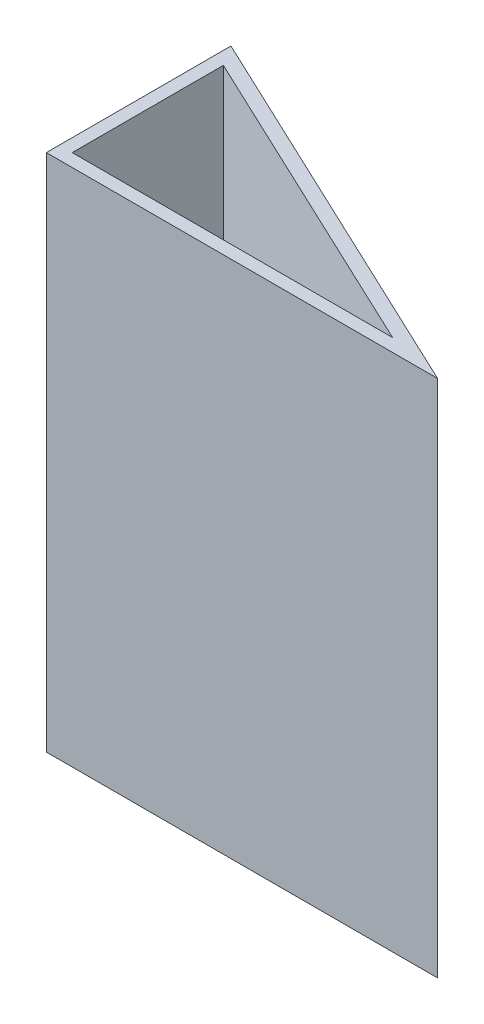
ISO-10303-21;
HEADER;
FILE_DESCRIPTION(('STEP AP214'),'2;1');
FILE_NAME('part.step','',(''),(''),'','','');
FILE_SCHEMA(('AUTOMOTIVE_DESIGN { 1 0 10303 214 1 1 1 1 }'));
ENDSEC;
DATA;
#1=APPLICATION_CONTEXT('core data for automotive mechanical design processes');
#2=APPLICATION_PROTOCOL_DEFINITION('international standard','automotive_design',2000,#1);
#3=PRODUCT_CONTEXT('',#1,'mechanical');
#4=PRODUCT('Part','Part','',(#3));
#5=PRODUCT_RELATED_PRODUCT_CATEGORY('part','',(#4));
#6=PRODUCT_DEFINITION_FORMATION('','',#4);
#7=PRODUCT_DEFINITION_CONTEXT('part definition',#1,'design');
#8=PRODUCT_DEFINITION('design','',#6,#7);
#9=PRODUCT_DEFINITION_SHAPE('','',#8);
#10=(LENGTH_UNIT() NAMED_UNIT(*) SI_UNIT(.MILLI.,.METRE.));
#11=(NAMED_UNIT(*) PLANE_ANGLE_UNIT() SI_UNIT($,.RADIAN.));
#12=(NAMED_UNIT(*) SI_UNIT($,.STERADIAN.) SOLID_ANGLE_UNIT());
#13=UNCERTAINTY_MEASURE_WITH_UNIT(LENGTH_MEASURE(1.E-05),#10,'distance_accuracy_value','');
#14=(GEOMETRIC_REPRESENTATION_CONTEXT(3) GLOBAL_UNCERTAINTY_ASSIGNED_CONTEXT((#13)) GLOBAL_UNIT_ASSIGNED_CONTEXT((#10,
#11,#12)) REPRESENTATION_CONTEXT('',''));
#15=CARTESIAN_POINT('',(0.,0.,0.));
#16=DIRECTION('',(0.,0.,1.));
#17=DIRECTION('',(1.,0.,0.));
#18=AXIS2_PLACEMENT_3D('',#15,#16,#17);
#19=CARTESIAN_POINT('',(-17.4601760956753,114.3,-2.47465147608017));
#20=DIRECTION('',(-0.426670121760486,0.,0.904407323719181));
#21=DIRECTION('',(0.904407323719181,0.,0.426670121760486));
#22=AXIS2_PLACEMENT_3D('',#19,#20,#21);
#23=PLANE('',#22);
#24=DIRECTION('',(-0.904407323719181,0.,-0.426670121760486));
#25=VECTOR('',#24,1.);
#26=CARTESIAN_POINT('',(-17.4601760956753,0.,-2.47465147608017));
#27=LINE('',#26,#25);
#28=CARTESIAN_POINT('',(68.6846214885767,0.,38.1656776216062));
#29=VERTEX_POINT('',#28);
#30=CARTESIAN_POINT('',(-17.4601760956753,0.,-2.47465147608017));
#31=VERTEX_POINT('',#30);
#32=EDGE_CURVE('E126',#29,#31,#27,.T.);
#33=ORIENTED_EDGE('',*,*,#32,.T.);
#34=DIRECTION('',(0.,-1.,0.));
#35=VECTOR('',#34,1.);
#36=CARTESIAN_POINT('',(-17.4601760956753,114.3,-2.47465147608017));
#37=LINE('',#36,#35);
#38=CARTESIAN_POINT('',(-17.4601760956753,114.3,-2.47465147608017));
#39=VERTEX_POINT('',#38);
#40=EDGE_CURVE('E11',#39,#31,#37,.T.);
#41=ORIENTED_EDGE('',*,*,#40,.F.);
#42=DIRECTION('',(-0.904407323719181,0.,-0.426670121760486));
#43=VECTOR('',#42,1.);
#44=CARTESIAN_POINT('',(-17.4601760956753,114.3,-2.47465147608017));
#45=LINE('',#44,#43);
#46=CARTESIAN_POINT('',(68.6846214885767,114.3,38.1656776216062));
#47=VERTEX_POINT('',#46);
#48=EDGE_CURVE('E129',#47,#39,#45,.T.);
#49=ORIENTED_EDGE('',*,*,#48,.F.);
#50=DIRECTION('',(0.,-1.,0.));
#51=VECTOR('',#50,1.);
#52=CARTESIAN_POINT('',(68.6846214885767,114.3,38.1656776216062));
#53=LINE('',#52,#51);
#54=EDGE_CURVE('E140',#47,#29,#53,.T.);
#55=ORIENTED_EDGE('',*,*,#54,.T.);
#56=EDGE_LOOP('',(#33,#41,#49,#55));
#57=FACE_BOUND('',#56,.T.);
#58=ADVANCED_FACE('F39',(#57),#23,.F.);
#59=CARTESIAN_POINT('',(-17.4601760956753,114.3,-2.47465147608017));
#60=DIRECTION('',(1.,0.,0.));
#61=DIRECTION('',(0.,0.,-1.));
#62=AXIS2_PLACEMENT_3D('',#59,#60,#61);
#63=PLANE('',#62);
#64=DIRECTION('',(0.,0.,1.));
#65=VECTOR('',#64,1.);
#66=CARTESIAN_POINT('',(-17.4601760956753,0.,-2.47465147608017));
#67=LINE('',#66,#65);
#68=CARTESIAN_POINT('',(-17.4601760956753,0.,38.1656776216062));
#69=VERTEX_POINT('',#68);
#70=EDGE_CURVE('E144',#31,#69,#67,.T.);
#71=ORIENTED_EDGE('',*,*,#70,.T.);
#72=DIRECTION('',(0.,-1.,0.));
#73=VECTOR('',#72,1.);
#74=CARTESIAN_POINT('',(-17.4601760956753,114.3,38.1656776216062));
#75=LINE('',#74,#73);
#76=CARTESIAN_POINT('',(-17.4601760956753,114.3,38.1656776216062));
#77=VERTEX_POINT('',#76);
#78=EDGE_CURVE('E47',#77,#69,#75,.T.);
#79=ORIENTED_EDGE('',*,*,#78,.F.);
#80=DIRECTION('',(0.,0.,1.));
#81=VECTOR('',#80,1.);
#82=CARTESIAN_POINT('',(-17.4601760956753,114.3,-2.47465147608017));
#83=LINE('',#82,#81);
#84=EDGE_CURVE('E133',#39,#77,#83,.T.);
#85=ORIENTED_EDGE('',*,*,#84,.F.);
#86=ORIENTED_EDGE('',*,*,#40,.T.);
#87=EDGE_LOOP('',(#71,#79,#85,#86));
#88=FACE_BOUND('',#87,.T.);
#89=ADVANCED_FACE('F166',(#88),#63,.F.);
#90=CARTESIAN_POINT('',(-17.4601760956753,114.3,38.1656776216062));
#91=DIRECTION('',(0.,0.,-1.));
#92=DIRECTION('',(-1.,0.,0.));
#93=AXIS2_PLACEMENT_3D('',#90,#91,#92);
#94=PLANE('',#93);
#95=DIRECTION('',(1.,0.,0.));
#96=VECTOR('',#95,1.);
#97=CARTESIAN_POINT('',(-17.4601760956753,0.,38.1656776216062));
#98=LINE('',#97,#96);
#99=EDGE_CURVE('E134',#69,#29,#98,.T.);
#100=ORIENTED_EDGE('',*,*,#99,.T.);
#101=ORIENTED_EDGE('',*,*,#54,.F.);
#102=DIRECTION('',(1.,0.,0.));
#103=VECTOR('',#102,1.);
#104=CARTESIAN_POINT('',(-17.4601760956753,114.3,38.1656776216062));
#105=LINE('',#104,#103);
#106=EDGE_CURVE('E137',#77,#47,#105,.T.);
#107=ORIENTED_EDGE('',*,*,#106,.F.);
#108=ORIENTED_EDGE('',*,*,#78,.T.);
#109=EDGE_LOOP('',(#100,#101,#107,#108));
#110=FACE_BOUND('',#109,.T.);
#111=ADVANCED_FACE('F157',(#110),#94,.F.);
#112=CARTESIAN_POINT('',(0.,114.3,0.));
#113=DIRECTION('',(0.,-1.,0.));
#114=DIRECTION('',(0.,0.,-1.));
#115=AXIS2_PLACEMENT_3D('',#112,#113,#114);
#116=PLANE('',#115);
#117=DIRECTION('',(0.,0.,1.));
#118=VECTOR('',#117,1.);
#119=CARTESIAN_POINT('',(-14.6065114956753,114.3,2.04687762160616));
#120=LINE('',#119,#118);
#121=CARTESIAN_POINT('',(-14.6065114956753,114.3,2.04687762160616));
#122=VERTEX_POINT('',#121);
#123=CARTESIAN_POINT('',(-14.6065114956753,114.3,35.3208776216062));
#124=VERTEX_POINT('',#123);
#125=EDGE_CURVE('E114',#122,#124,#120,.T.);
#126=ORIENTED_EDGE('',*,*,#125,.F.);
#127=DIRECTION('',(-0.904410470321237,0.,-0.426663451883706));
#128=VECTOR('',#127,1.);
#129=CARTESIAN_POINT('',(-14.6065114956753,114.3,2.04687762160616));
#130=LINE('',#129,#128);
#131=CARTESIAN_POINT('',(55.9253183496222,114.3,35.3208776216062));
#132=VERTEX_POINT('',#131);
#133=EDGE_CURVE('E54',#132,#122,#130,.T.);
#134=ORIENTED_EDGE('',*,*,#133,.F.);
#135=DIRECTION('',(1.,0.,0.));
#136=VECTOR('',#135,1.);
#137=CARTESIAN_POINT('',(-14.6065114956753,114.3,35.3208776216062));
#138=LINE('',#137,#136);
#139=EDGE_CURVE('E110',#124,#132,#138,.T.);
#140=ORIENTED_EDGE('',*,*,#139,.F.);
#141=EDGE_LOOP('',(#126,#134,#140));
#142=FACE_BOUND('',#141,.T.);
#143=ORIENTED_EDGE('',*,*,#48,.T.);
#144=ORIENTED_EDGE('',*,*,#84,.T.);
#145=ORIENTED_EDGE('',*,*,#106,.T.);
#146=EDGE_LOOP('',(#143,#144,#145));
#147=FACE_BOUND('',#146,.T.);
#148=ADVANCED_FACE('F165',(#142,#147),#116,.F.);
#149=CARTESIAN_POINT('',(0.,0.,0.));
#150=DIRECTION('',(0.,-1.,0.));
#151=DIRECTION('',(0.,0.,-1.));
#152=AXIS2_PLACEMENT_3D('',#149,#150,#151);
#153=PLANE('',#152);
#154=DIRECTION('',(-0.904410470321237,0.,-0.426663451883706));
#155=VECTOR('',#154,1.);
#156=CARTESIAN_POINT('',(-14.6065114956753,0.,2.04687762160616));
#157=LINE('',#156,#155);
#158=CARTESIAN_POINT('',(55.9253183496222,0.,35.3208776216062));
#159=VERTEX_POINT('',#158);
#160=CARTESIAN_POINT('',(-14.6065114956753,0.,2.04687762160616));
#161=VERTEX_POINT('',#160);
#162=EDGE_CURVE('E94',#159,#161,#157,.T.);
#163=ORIENTED_EDGE('',*,*,#162,.T.);
#164=DIRECTION('',(0.,0.,1.));
#165=VECTOR('',#164,1.);
#166=CARTESIAN_POINT('',(-14.6065114956753,0.,2.04687762160616));
#167=LINE('',#166,#165);
#168=CARTESIAN_POINT('',(-14.6065114956753,0.,35.3208776216062));
#169=VERTEX_POINT('',#168);
#170=EDGE_CURVE('E102',#161,#169,#167,.T.);
#171=ORIENTED_EDGE('',*,*,#170,.T.);
#172=DIRECTION('',(1.,0.,0.));
#173=VECTOR('',#172,1.);
#174=CARTESIAN_POINT('',(-14.6065114956753,0.,35.3208776216062));
#175=LINE('',#174,#173);
#176=EDGE_CURVE('E62',#169,#159,#175,.T.);
#177=ORIENTED_EDGE('',*,*,#176,.T.);
#178=EDGE_LOOP('',(#163,#171,#177));
#179=FACE_BOUND('',#178,.T.);
#180=ORIENTED_EDGE('',*,*,#32,.F.);
#181=ORIENTED_EDGE('',*,*,#99,.F.);
#182=ORIENTED_EDGE('',*,*,#70,.F.);
#183=EDGE_LOOP('',(#180,#181,#182));
#184=FACE_BOUND('',#183,.T.);
#185=ADVANCED_FACE('F107',(#179,#184),#153,.T.);
#186=CARTESIAN_POINT('',(-14.6065114956753,0.,2.04687762160616));
#187=DIRECTION('',(0.426663451883706,0.,-0.904410470321237));
#188=DIRECTION('',(-0.904410470321237,0.,-0.426663451883706));
#189=AXIS2_PLACEMENT_3D('',#186,#187,#188);
#190=PLANE('',#189);
#191=ORIENTED_EDGE('',*,*,#133,.T.);
#192=DIRECTION('',(0.,1.,0.));
#193=VECTOR('',#192,1.);
#194=CARTESIAN_POINT('',(-14.6065114956753,0.,2.04687762160616));
#195=LINE('',#194,#193);
#196=EDGE_CURVE('E90',#161,#122,#195,.T.);
#197=ORIENTED_EDGE('',*,*,#196,.F.);
#198=ORIENTED_EDGE('',*,*,#162,.F.);
#199=DIRECTION('',(0.,1.,0.));
#200=VECTOR('',#199,1.);
#201=CARTESIAN_POINT('',(55.9253183496222,0.,35.3208776216062));
#202=LINE('',#201,#200);
#203=EDGE_CURVE('E123',#159,#132,#202,.T.);
#204=ORIENTED_EDGE('',*,*,#203,.T.);
#205=EDGE_LOOP('',(#191,#197,#198,#204));
#206=FACE_BOUND('',#205,.T.);
#207=ADVANCED_FACE('F92',(#206),#190,.F.);
#208=CARTESIAN_POINT('',(-14.6065114956753,0.,35.3208776216062));
#209=DIRECTION('',(0.,0.,1.));
#210=DIRECTION('',(1.,0.,0.));
#211=AXIS2_PLACEMENT_3D('',#208,#209,#210);
#212=PLANE('',#211);
#213=ORIENTED_EDGE('',*,*,#139,.T.);
#214=ORIENTED_EDGE('',*,*,#203,.F.);
#215=ORIENTED_EDGE('',*,*,#176,.F.);
#216=DIRECTION('',(0.,1.,0.));
#217=VECTOR('',#216,1.);
#218=CARTESIAN_POINT('',(-14.6065114956753,0.,35.3208776216062));
#219=LINE('',#218,#217);
#220=EDGE_CURVE('E99',#169,#124,#219,.T.);
#221=ORIENTED_EDGE('',*,*,#220,.T.);
#222=EDGE_LOOP('',(#213,#214,#215,#221));
#223=FACE_BOUND('',#222,.T.);
#224=ADVANCED_FACE('F181',(#223),#212,.F.);
#225=CARTESIAN_POINT('',(-14.6065114956753,0.,2.04687762160616));
#226=DIRECTION('',(-1.,0.,0.));
#227=DIRECTION('',(0.,0.,1.));
#228=AXIS2_PLACEMENT_3D('',#225,#226,#227);
#229=PLANE('',#228);
#230=ORIENTED_EDGE('',*,*,#125,.T.);
#231=ORIENTED_EDGE('',*,*,#220,.F.);
#232=ORIENTED_EDGE('',*,*,#170,.F.);
#233=ORIENTED_EDGE('',*,*,#196,.T.);
#234=EDGE_LOOP('',(#230,#231,#232,#233));
#235=FACE_BOUND('',#234,.T.);
#236=ADVANCED_FACE('F103',(#235),#229,.F.);
#237=CLOSED_SHELL('',(#58,#89,#111,#148,#185,#207,#224,#236));
#238=MANIFOLD_SOLID_BREP('B2',#237);
#239=ADVANCED_BREP_SHAPE_REPRESENTATION('',(#18,#238),#14);
#240=SHAPE_DEFINITION_REPRESENTATION(#9,#239);
ENDSEC;
END-ISO-10303-21;
